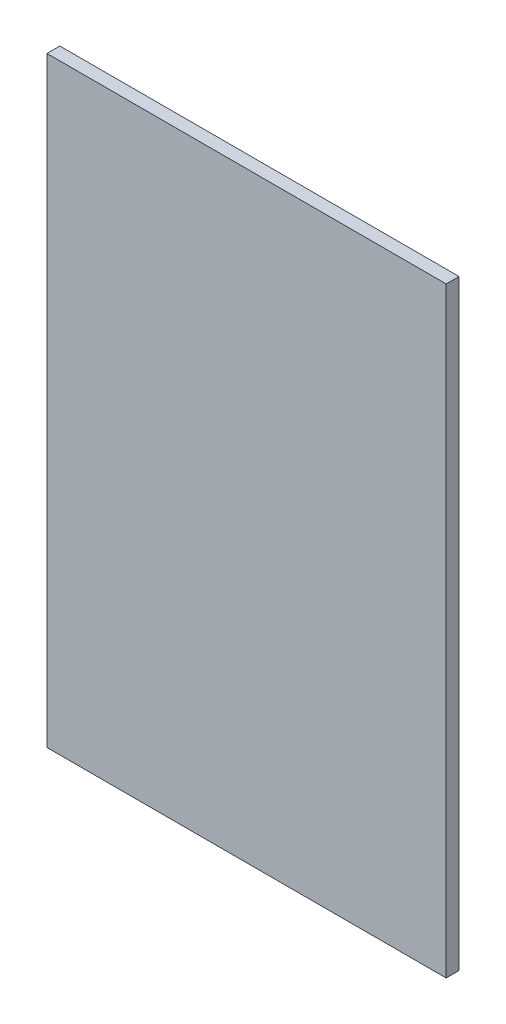
ISO-10303-21;
HEADER;
FILE_DESCRIPTION(('STEP AP214'),'2;1');
FILE_NAME('part.step','',(''),(''),'','','');
FILE_SCHEMA(('AUTOMOTIVE_DESIGN { 1 0 10303 214 1 1 1 1 }'));
ENDSEC;
DATA;
#1=APPLICATION_CONTEXT('core data for automotive mechanical design processes');
#2=APPLICATION_PROTOCOL_DEFINITION('international standard','automotive_design',2000,#1);
#3=PRODUCT_CONTEXT('',#1,'mechanical');
#4=PRODUCT('Part','Part','',(#3));
#5=PRODUCT_RELATED_PRODUCT_CATEGORY('part','',(#4));
#6=PRODUCT_DEFINITION_FORMATION('','',#4);
#7=PRODUCT_DEFINITION_CONTEXT('part definition',#1,'design');
#8=PRODUCT_DEFINITION('design','',#6,#7);
#9=PRODUCT_DEFINITION_SHAPE('','',#8);
#10=(LENGTH_UNIT() NAMED_UNIT(*) SI_UNIT(.MILLI.,.METRE.));
#11=(NAMED_UNIT(*) PLANE_ANGLE_UNIT() SI_UNIT($,.RADIAN.));
#12=(NAMED_UNIT(*) SI_UNIT($,.STERADIAN.) SOLID_ANGLE_UNIT());
#13=UNCERTAINTY_MEASURE_WITH_UNIT(LENGTH_MEASURE(1.E-05),#10,'distance_accuracy_value','');
#14=(GEOMETRIC_REPRESENTATION_CONTEXT(3) GLOBAL_UNCERTAINTY_ASSIGNED_CONTEXT((#13)) GLOBAL_UNIT_ASSIGNED_CONTEXT((#10,
#11,#12)) REPRESENTATION_CONTEXT('',''));
#15=CARTESIAN_POINT('',(0.,0.,0.));
#16=DIRECTION('',(0.,0.,1.));
#17=DIRECTION('',(1.,0.,0.));
#18=AXIS2_PLACEMENT_3D('',#15,#16,#17);
#19=CARTESIAN_POINT('',(0.,0.,4.));
#20=DIRECTION('',(1.,0.,0.));
#21=DIRECTION('',(0.,1.,0.));
#22=AXIS2_PLACEMENT_3D('',#19,#20,#21);
#23=PLANE('',#22);
#24=DIRECTION('',(0.,-1.,0.));
#25=VECTOR('',#24,1.);
#26=CARTESIAN_POINT('',(0.,0.,0.));
#27=LINE('',#26,#25);
#28=CARTESIAN_POINT('',(0.,0.,0.));
#29=VERTEX_POINT('',#28);
#30=CARTESIAN_POINT('',(0.,-186.4,0.));
#31=VERTEX_POINT('',#30);
#32=EDGE_CURVE('E113',#29,#31,#27,.T.);
#33=ORIENTED_EDGE('',*,*,#32,.T.);
#34=DIRECTION('',(0.,0.,-1.));
#35=VECTOR('',#34,1.);
#36=CARTESIAN_POINT('',(0.,-186.4,4.));
#37=LINE('',#36,#35);
#38=CARTESIAN_POINT('',(0.,-186.4,4.));
#39=VERTEX_POINT('',#38);
#40=EDGE_CURVE('E11',#39,#31,#37,.T.);
#41=ORIENTED_EDGE('',*,*,#40,.F.);
#42=DIRECTION('',(0.,-1.,0.));
#43=VECTOR('',#42,1.);
#44=CARTESIAN_POINT('',(0.,0.,4.));
#45=LINE('',#44,#43);
#46=CARTESIAN_POINT('',(0.,0.,4.));
#47=VERTEX_POINT('',#46);
#48=EDGE_CURVE('E97',#47,#39,#45,.T.);
#49=ORIENTED_EDGE('',*,*,#48,.F.);
#50=DIRECTION('',(0.,0.,-1.));
#51=VECTOR('',#50,1.);
#52=CARTESIAN_POINT('',(0.,0.,4.));
#53=LINE('',#52,#51);
#54=EDGE_CURVE('E109',#47,#29,#53,.T.);
#55=ORIENTED_EDGE('',*,*,#54,.T.);
#56=EDGE_LOOP('',(#33,#41,#49,#55));
#57=FACE_BOUND('',#56,.T.);
#58=ADVANCED_FACE('F45',(#57),#23,.F.);
#59=CARTESIAN_POINT('',(0.,-186.4,4.));
#60=DIRECTION('',(0.,1.,0.));
#61=DIRECTION('',(0.,0.,1.));
#62=AXIS2_PLACEMENT_3D('',#59,#60,#61);
#63=PLANE('',#62);
#64=DIRECTION('',(1.,0.,0.));
#65=VECTOR('',#64,1.);
#66=CARTESIAN_POINT('',(0.,-186.4,0.));
#67=LINE('',#66,#65);
#68=CARTESIAN_POINT('',(123.8,-186.4,0.));
#69=VERTEX_POINT('',#68);
#70=EDGE_CURVE('E102',#31,#69,#67,.T.);
#71=ORIENTED_EDGE('',*,*,#70,.T.);
#72=DIRECTION('',(0.,0.,-1.));
#73=VECTOR('',#72,1.);
#74=CARTESIAN_POINT('',(123.8,-186.4,4.));
#75=LINE('',#74,#73);
#76=CARTESIAN_POINT('',(123.8,-186.4,4.));
#77=VERTEX_POINT('',#76);
#78=EDGE_CURVE('E54',#77,#69,#75,.T.);
#79=ORIENTED_EDGE('',*,*,#78,.F.);
#80=DIRECTION('',(1.,0.,0.));
#81=VECTOR('',#80,1.);
#82=CARTESIAN_POINT('',(0.,-186.4,4.));
#83=LINE('',#82,#81);
#84=EDGE_CURVE('E92',#39,#77,#83,.T.);
#85=ORIENTED_EDGE('',*,*,#84,.F.);
#86=ORIENTED_EDGE('',*,*,#40,.T.);
#87=EDGE_LOOP('',(#71,#79,#85,#86));
#88=FACE_BOUND('',#87,.T.);
#89=ADVANCED_FACE('F101',(#88),#63,.F.);
#90=CARTESIAN_POINT('',(123.8,0.,4.));
#91=DIRECTION('',(-1.,0.,0.));
#92=DIRECTION('',(0.,-1.,0.));
#93=AXIS2_PLACEMENT_3D('',#90,#91,#92);
#94=PLANE('',#93);
#95=DIRECTION('',(0.,1.,0.));
#96=VECTOR('',#95,1.);
#97=CARTESIAN_POINT('',(123.8,0.,0.));
#98=LINE('',#97,#96);
#99=CARTESIAN_POINT('',(123.8,0.,0.));
#100=VERTEX_POINT('',#99);
#101=EDGE_CURVE('E79',#69,#100,#98,.T.);
#102=ORIENTED_EDGE('',*,*,#101,.T.);
#103=DIRECTION('',(0.,0.,-1.));
#104=VECTOR('',#103,1.);
#105=CARTESIAN_POINT('',(123.8,0.,4.));
#106=LINE('',#105,#104);
#107=CARTESIAN_POINT('',(123.8,0.,4.));
#108=VERTEX_POINT('',#107);
#109=EDGE_CURVE('E104',#108,#100,#106,.T.);
#110=ORIENTED_EDGE('',*,*,#109,.F.);
#111=DIRECTION('',(0.,1.,0.));
#112=VECTOR('',#111,1.);
#113=CARTESIAN_POINT('',(123.8,0.,4.));
#114=LINE('',#113,#112);
#115=EDGE_CURVE('E95',#77,#108,#114,.T.);
#116=ORIENTED_EDGE('',*,*,#115,.F.);
#117=ORIENTED_EDGE('',*,*,#78,.T.);
#118=EDGE_LOOP('',(#102,#110,#116,#117));
#119=FACE_BOUND('',#118,.T.);
#120=ADVANCED_FACE('F105',(#119),#94,.F.);
#121=CARTESIAN_POINT('',(0.,0.,4.));
#122=DIRECTION('',(0.,-1.,0.));
#123=DIRECTION('',(0.,0.,-1.));
#124=AXIS2_PLACEMENT_3D('',#121,#122,#123);
#125=PLANE('',#124);
#126=DIRECTION('',(-1.,0.,0.));
#127=VECTOR('',#126,1.);
#128=CARTESIAN_POINT('',(0.,0.,0.));
#129=LINE('',#128,#127);
#130=EDGE_CURVE('E85',#100,#29,#129,.T.);
#131=ORIENTED_EDGE('',*,*,#130,.T.);
#132=ORIENTED_EDGE('',*,*,#54,.F.);
#133=DIRECTION('',(-1.,0.,0.));
#134=VECTOR('',#133,1.);
#135=CARTESIAN_POINT('',(0.,0.,4.));
#136=LINE('',#135,#134);
#137=EDGE_CURVE('E62',#108,#47,#136,.T.);
#138=ORIENTED_EDGE('',*,*,#137,.F.);
#139=ORIENTED_EDGE('',*,*,#109,.T.);
#140=EDGE_LOOP('',(#131,#132,#138,#139));
#141=FACE_BOUND('',#140,.T.);
#142=ADVANCED_FACE('F126',(#141),#125,.F.);
#143=CARTESIAN_POINT('',(0.,0.,4.));
#144=DIRECTION('',(0.,0.,1.));
#145=DIRECTION('',(1.,0.,0.));
#146=AXIS2_PLACEMENT_3D('',#143,#144,#145);
#147=PLANE('',#146);
#148=ORIENTED_EDGE('',*,*,#48,.T.);
#149=ORIENTED_EDGE('',*,*,#84,.T.);
#150=ORIENTED_EDGE('',*,*,#115,.T.);
#151=ORIENTED_EDGE('',*,*,#137,.T.);
#152=EDGE_LOOP('',(#148,#149,#150,#151));
#153=FACE_BOUND('',#152,.T.);
#154=ADVANCED_FACE('F93',(#153),#147,.T.);
#155=CARTESIAN_POINT('',(0.,0.,0.));
#156=DIRECTION('',(0.,0.,1.));
#157=DIRECTION('',(1.,0.,0.));
#158=AXIS2_PLACEMENT_3D('',#155,#156,#157);
#159=PLANE('',#158);
#160=ORIENTED_EDGE('',*,*,#32,.F.);
#161=ORIENTED_EDGE('',*,*,#130,.F.);
#162=ORIENTED_EDGE('',*,*,#101,.F.);
#163=ORIENTED_EDGE('',*,*,#70,.F.);
#164=EDGE_LOOP('',(#160,#161,#162,#163));
#165=FACE_BOUND('',#164,.T.);
#166=ADVANCED_FACE('F129',(#165),#159,.F.);
#167=CLOSED_SHELL('',(#58,#89,#120,#142,#154,#166));
#168=MANIFOLD_SOLID_BREP('B2',#167);
#169=ADVANCED_BREP_SHAPE_REPRESENTATION('',(#18,#168),#14);
#170=SHAPE_DEFINITION_REPRESENTATION(#9,#169);
ENDSEC;
END-ISO-10303-21;
